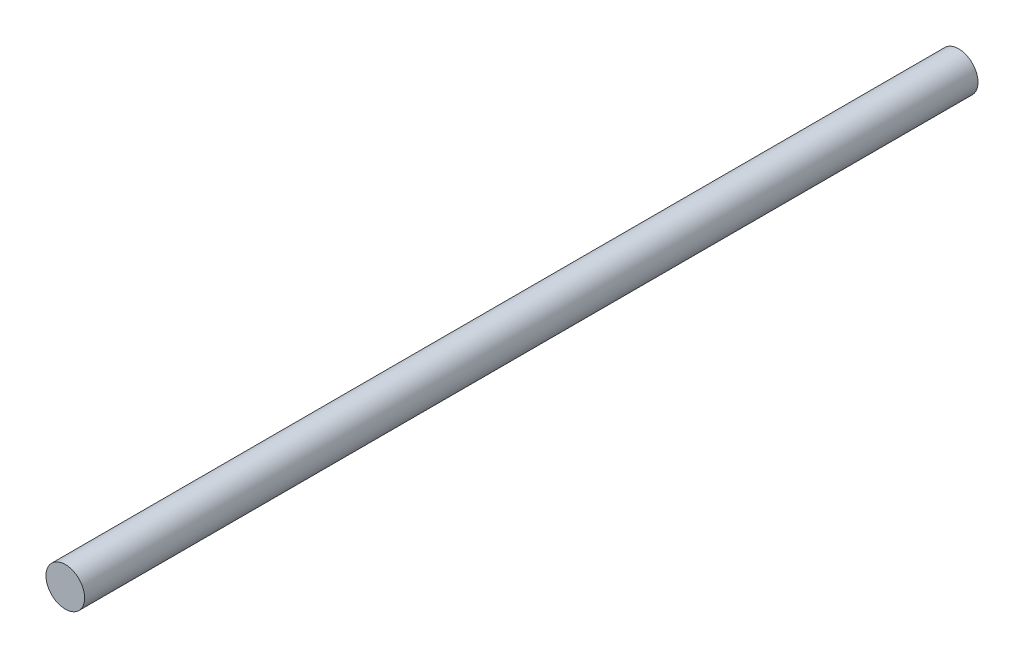
ISO-10303-21;
HEADER;
FILE_DESCRIPTION(('STEP AP214'),'2;1');
FILE_NAME('part.step','',(''),(''),'','','');
FILE_SCHEMA(('AUTOMOTIVE_DESIGN { 1 0 10303 214 1 1 1 1 }'));
ENDSEC;
DATA;
#1=APPLICATION_CONTEXT('core data for automotive mechanical design processes');
#2=APPLICATION_PROTOCOL_DEFINITION('international standard','automotive_design',2000,#1);
#3=PRODUCT_CONTEXT('',#1,'mechanical');
#4=PRODUCT('Part','Part','',(#3));
#5=PRODUCT_RELATED_PRODUCT_CATEGORY('part','',(#4));
#6=PRODUCT_DEFINITION_FORMATION('','',#4);
#7=PRODUCT_DEFINITION_CONTEXT('part definition',#1,'design');
#8=PRODUCT_DEFINITION('design','',#6,#7);
#9=PRODUCT_DEFINITION_SHAPE('','',#8);
#10=(LENGTH_UNIT() NAMED_UNIT(*) SI_UNIT(.MILLI.,.METRE.));
#11=(NAMED_UNIT(*) PLANE_ANGLE_UNIT() SI_UNIT($,.RADIAN.));
#12=(NAMED_UNIT(*) SI_UNIT($,.STERADIAN.) SOLID_ANGLE_UNIT());
#13=UNCERTAINTY_MEASURE_WITH_UNIT(LENGTH_MEASURE(1.E-05),#10,'distance_accuracy_value','');
#14=(GEOMETRIC_REPRESENTATION_CONTEXT(3) GLOBAL_UNCERTAINTY_ASSIGNED_CONTEXT((#13)) GLOBAL_UNIT_ASSIGNED_CONTEXT((#10,
#11,#12)) REPRESENTATION_CONTEXT('',''));
#15=CARTESIAN_POINT('',(0.,0.,0.));
#16=DIRECTION('',(0.,0.,1.));
#17=DIRECTION('',(1.,0.,0.));
#18=AXIS2_PLACEMENT_3D('',#15,#16,#17);
#19=CARTESIAN_POINT('',(0.,0.,300.));
#20=DIRECTION('',(0.,0.,-1.));
#21=DIRECTION('',(-1.,0.,0.));
#22=AXIS2_PLACEMENT_3D('',#19,#20,#21);
#23=CYLINDRICAL_SURFACE('',#22,6.5);
#24=CARTESIAN_POINT('',(0.,0.,300.));
#25=DIRECTION('',(0.,0.,1.));
#26=DIRECTION('',(1.,0.,0.));
#27=AXIS2_PLACEMENT_3D('',#24,#25,#26);
#28=CIRCLE('',#27,6.5);
#29=CARTESIAN_POINT('',(6.5,0.,300.));
#30=VERTEX_POINT('',#29);
#31=EDGE_CURVE('E10',#30,#30,#28,.T.);
#32=ORIENTED_EDGE('',*,*,#31,.F.);
#33=EDGE_LOOP('',(#32));
#34=FACE_BOUND('',#33,.T.);
#35=CARTESIAN_POINT('',(0.,0.,0.));
#36=DIRECTION('',(0.,0.,1.));
#37=DIRECTION('',(1.,0.,0.));
#38=AXIS2_PLACEMENT_3D('',#35,#36,#37);
#39=CIRCLE('',#38,6.5);
#40=CARTESIAN_POINT('',(6.5,0.,0.));
#41=VERTEX_POINT('',#40);
#42=EDGE_CURVE('E46',#41,#41,#39,.T.);
#43=ORIENTED_EDGE('',*,*,#42,.T.);
#44=EDGE_LOOP('',(#43));
#45=FACE_BOUND('',#44,.T.);
#46=ADVANCED_FACE('F43',(#34,#45),#23,.T.);
#47=CARTESIAN_POINT('',(0.,0.,300.));
#48=DIRECTION('',(0.,0.,1.));
#49=DIRECTION('',(1.,0.,0.));
#50=AXIS2_PLACEMENT_3D('',#47,#48,#49);
#51=PLANE('',#50);
#52=ORIENTED_EDGE('',*,*,#31,.T.);
#53=EDGE_LOOP('',(#52));
#54=FACE_BOUND('',#53,.T.);
#55=ADVANCED_FACE('F60',(#54),#51,.T.);
#56=CARTESIAN_POINT('',(0.,0.,0.));
#57=DIRECTION('',(0.,0.,1.));
#58=DIRECTION('',(1.,0.,0.));
#59=AXIS2_PLACEMENT_3D('',#56,#57,#58);
#60=PLANE('',#59);
#61=ORIENTED_EDGE('',*,*,#42,.F.);
#62=EDGE_LOOP('',(#61));
#63=FACE_BOUND('',#62,.T.);
#64=ADVANCED_FACE('F58',(#63),#60,.F.);
#65=CLOSED_SHELL('',(#46,#55,#64));
#66=MANIFOLD_SOLID_BREP('B2',#65);
#67=ADVANCED_BREP_SHAPE_REPRESENTATION('',(#18,#66),#14);
#68=SHAPE_DEFINITION_REPRESENTATION(#9,#67);
ENDSEC;
END-ISO-10303-21;
